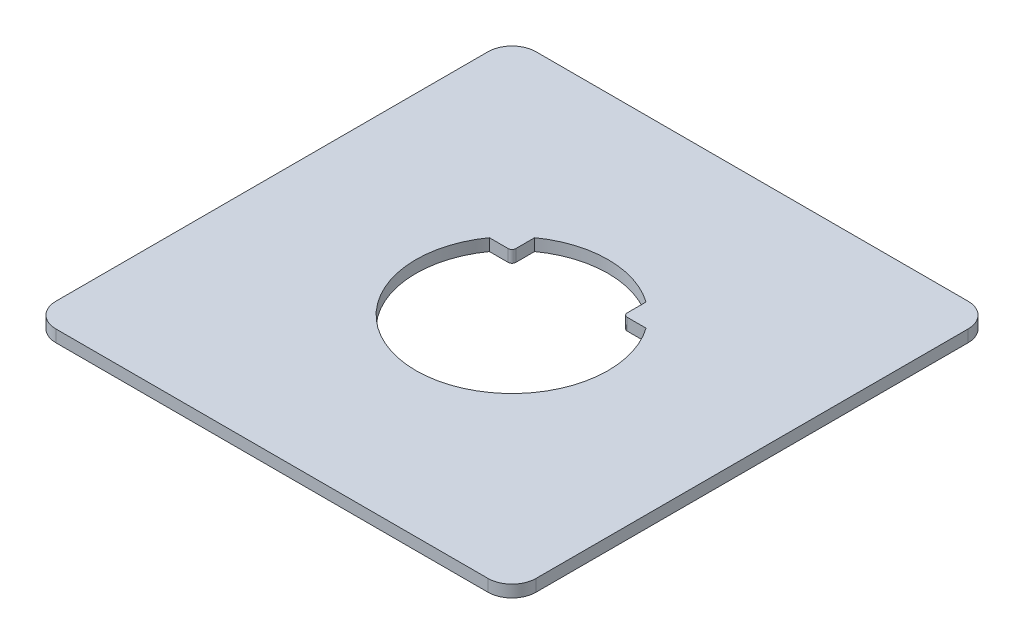
ISO-10303-21;
HEADER;
FILE_DESCRIPTION(('STEP AP214'),'2;1');
FILE_NAME('part.step','',(''),(''),'','','');
FILE_SCHEMA(('AUTOMOTIVE_DESIGN { 1 0 10303 214 1 1 1 1 }'));
ENDSEC;
DATA;
#1=APPLICATION_CONTEXT('core data for automotive mechanical design processes');
#2=APPLICATION_PROTOCOL_DEFINITION('international standard','automotive_design',2000,#1);
#3=PRODUCT_CONTEXT('',#1,'mechanical');
#4=PRODUCT('Part','Part','',(#3));
#5=PRODUCT_RELATED_PRODUCT_CATEGORY('part','',(#4));
#6=PRODUCT_DEFINITION_FORMATION('','',#4);
#7=PRODUCT_DEFINITION_CONTEXT('part definition',#1,'design');
#8=PRODUCT_DEFINITION('design','',#6,#7);
#9=PRODUCT_DEFINITION_SHAPE('','',#8);
#10=(LENGTH_UNIT() NAMED_UNIT(*) SI_UNIT(.MILLI.,.METRE.));
#11=(NAMED_UNIT(*) PLANE_ANGLE_UNIT() SI_UNIT($,.RADIAN.));
#12=(NAMED_UNIT(*) SI_UNIT($,.STERADIAN.) SOLID_ANGLE_UNIT());
#13=UNCERTAINTY_MEASURE_WITH_UNIT(LENGTH_MEASURE(1.E-05),#10,'distance_accuracy_value','');
#14=(GEOMETRIC_REPRESENTATION_CONTEXT(3) GLOBAL_UNCERTAINTY_ASSIGNED_CONTEXT((#13)) GLOBAL_UNIT_ASSIGNED_CONTEXT((#10,
#11,#12)) REPRESENTATION_CONTEXT('',''));
#15=CARTESIAN_POINT('',(0.,0.,0.));
#16=DIRECTION('',(0.,0.,1.));
#17=DIRECTION('',(1.,0.,0.));
#18=AXIS2_PLACEMENT_3D('',#15,#16,#17);
#19=CARTESIAN_POINT('',(0.,1.5875,0.));
#20=DIRECTION('',(0.,-1.,0.));
#21=DIRECTION('',(0.,0.,-1.));
#22=AXIS2_PLACEMENT_3D('',#19,#20,#21);
#23=PLANE('',#22);
#24=DIRECTION('',(1.,0.,0.));
#25=VECTOR('',#24,1.);
#26=CARTESIAN_POINT('',(0.,1.5875,0.));
#27=LINE('',#26,#25);
#28=CARTESIAN_POINT('',(3.175,1.5875,0.));
#29=VERTEX_POINT('',#28);
#30=CARTESIAN_POINT('',(60.325,1.5875,0.));
#31=VERTEX_POINT('',#30);
#32=EDGE_CURVE('E231',#29,#31,#27,.T.);
#33=ORIENTED_EDGE('',*,*,#32,.T.);
#34=CARTESIAN_POINT('',(60.325,1.5875,-3.175));
#35=DIRECTION('',(0.,-1.,0.));
#36=DIRECTION('',(0.,0.,-1.));
#37=AXIS2_PLACEMENT_3D('',#34,#35,#36);
#38=CIRCLE('',#37,3.175);
#39=CARTESIAN_POINT('',(63.5,1.5875,-3.175));
#40=VERTEX_POINT('',#39);
#41=EDGE_CURVE('E313',#31,#40,#38,.F.);
#42=ORIENTED_EDGE('',*,*,#41,.T.);
#43=DIRECTION('',(0.,0.,-1.));
#44=VECTOR('',#43,1.);
#45=CARTESIAN_POINT('',(63.5,1.5875,0.));
#46=LINE('',#45,#44);
#47=CARTESIAN_POINT('',(63.5,1.5875,-60.325));
#48=VERTEX_POINT('',#47);
#49=EDGE_CURVE('E236',#40,#48,#46,.T.);
#50=ORIENTED_EDGE('',*,*,#49,.T.);
#51=CARTESIAN_POINT('',(60.325,1.5875,-60.325));
#52=DIRECTION('',(0.,-1.,0.));
#53=DIRECTION('',(0.,0.,-1.));
#54=AXIS2_PLACEMENT_3D('',#51,#52,#53);
#55=CIRCLE('',#54,3.175);
#56=CARTESIAN_POINT('',(60.325,1.5875,-63.5));
#57=VERTEX_POINT('',#56);
#58=EDGE_CURVE('E62',#48,#57,#55,.F.);
#59=ORIENTED_EDGE('',*,*,#58,.T.);
#60=DIRECTION('',(-1.,0.,0.));
#61=VECTOR('',#60,1.);
#62=CARTESIAN_POINT('',(0.,1.5875,-63.5));
#63=LINE('',#62,#61);
#64=CARTESIAN_POINT('',(3.175,1.5875,-63.5));
#65=VERTEX_POINT('',#64);
#66=EDGE_CURVE('E239',#57,#65,#63,.T.);
#67=ORIENTED_EDGE('',*,*,#66,.T.);
#68=CARTESIAN_POINT('',(3.175,1.5875,-60.325));
#69=DIRECTION('',(0.,-1.,0.));
#70=DIRECTION('',(0.,0.,-1.));
#71=AXIS2_PLACEMENT_3D('',#68,#69,#70);
#72=CIRCLE('',#71,3.175);
#73=CARTESIAN_POINT('',(0.,1.5875,-60.325));
#74=VERTEX_POINT('',#73);
#75=EDGE_CURVE('E308',#65,#74,#72,.F.);
#76=ORIENTED_EDGE('',*,*,#75,.T.);
#77=DIRECTION('',(0.,0.,1.));
#78=VECTOR('',#77,1.);
#79=CARTESIAN_POINT('',(0.,1.5875,0.));
#80=LINE('',#79,#78);
#81=CARTESIAN_POINT('',(0.,1.5875,-3.175));
#82=VERTEX_POINT('',#81);
#83=EDGE_CURVE('E227',#74,#82,#80,.T.);
#84=ORIENTED_EDGE('',*,*,#83,.T.);
#85=CARTESIAN_POINT('',(3.175,1.5875,-3.175));
#86=DIRECTION('',(0.,-1.,0.));
#87=DIRECTION('',(0.,0.,-1.));
#88=AXIS2_PLACEMENT_3D('',#85,#86,#87);
#89=CIRCLE('',#88,3.175);
#90=EDGE_CURVE('E305',#82,#29,#89,.F.);
#91=ORIENTED_EDGE('',*,*,#90,.T.);
#92=EDGE_LOOP('',(#33,#42,#50,#59,#67,#76,#84,#91));
#93=FACE_BOUND('',#92,.T.);
#94=DIRECTION('',(0.,0.,-1.));
#95=VECTOR('',#94,1.);
#96=CARTESIAN_POINT('',(39.116,1.5875,-42.1112154349767));
#97=LINE('',#96,#95);
#98=CARTESIAN_POINT('',(39.116,1.5875,-39.624));
#99=VERTEX_POINT('',#98);
#100=CARTESIAN_POINT('',(39.116,1.5875,-42.1112154349767));
#101=VERTEX_POINT('',#100);
#102=EDGE_CURVE('E198',#99,#101,#97,.T.);
#103=ORIENTED_EDGE('',*,*,#102,.F.);
#104=CARTESIAN_POINT('',(39.624,1.5875,-39.624));
#105=DIRECTION('',(0.,-1.,0.));
#106=DIRECTION('',(0.,0.,-1.));
#107=AXIS2_PLACEMENT_3D('',#104,#105,#106);
#108=CIRCLE('',#107,0.508);
#109=CARTESIAN_POINT('',(39.624,1.5875,-39.116));
#110=VERTEX_POINT('',#109);
#111=EDGE_CURVE('E270',#99,#110,#108,.F.);
#112=ORIENTED_EDGE('',*,*,#111,.T.);
#113=DIRECTION('',(-1.,0.,0.));
#114=VECTOR('',#113,1.);
#115=CARTESIAN_POINT('',(39.116,1.5875,-39.116));
#116=LINE('',#115,#114);
#117=CARTESIAN_POINT('',(42.1112154349767,1.5875,-39.116));
#118=VERTEX_POINT('',#117);
#119=EDGE_CURVE('E194',#118,#110,#116,.T.);
#120=ORIENTED_EDGE('',*,*,#119,.F.);
#121=CARTESIAN_POINT('',(31.75,1.5875,-31.75));
#122=DIRECTION('',(0.,1.,0.));
#123=DIRECTION('',(0.,0.,1.));
#124=AXIS2_PLACEMENT_3D('',#121,#122,#123);
#125=CIRCLE('',#124,12.7127);
#126=CARTESIAN_POINT('',(21.3887845650233,1.5875,-39.116));
#127=VERTEX_POINT('',#126);
#128=EDGE_CURVE('E189',#127,#118,#125,.T.);
#129=ORIENTED_EDGE('',*,*,#128,.F.);
#130=DIRECTION('',(-1.,0.,0.));
#131=VECTOR('',#130,1.);
#132=CARTESIAN_POINT('',(24.384,1.5875,-39.116));
#133=LINE('',#132,#131);
#134=CARTESIAN_POINT('',(23.876,1.5875,-39.116));
#135=VERTEX_POINT('',#134);
#136=EDGE_CURVE('E186',#135,#127,#133,.T.);
#137=ORIENTED_EDGE('',*,*,#136,.F.);
#138=CARTESIAN_POINT('',(23.876,1.5875,-39.624));
#139=DIRECTION('',(0.,-1.,0.));
#140=DIRECTION('',(0.,0.,-1.));
#141=AXIS2_PLACEMENT_3D('',#138,#139,#140);
#142=CIRCLE('',#141,0.508);
#143=CARTESIAN_POINT('',(24.384,1.5875,-39.624));
#144=VERTEX_POINT('',#143);
#145=EDGE_CURVE('E184',#135,#144,#142,.F.);
#146=ORIENTED_EDGE('',*,*,#145,.T.);
#147=DIRECTION('',(0.,0.,1.));
#148=VECTOR('',#147,1.);
#149=CARTESIAN_POINT('',(24.384,1.5875,-42.1112154349767));
#150=LINE('',#149,#148);
#151=CARTESIAN_POINT('',(24.384,1.5875,-42.1112154349767));
#152=VERTEX_POINT('',#151);
#153=EDGE_CURVE('E168',#152,#144,#150,.T.);
#154=ORIENTED_EDGE('',*,*,#153,.F.);
#155=CARTESIAN_POINT('',(31.75,1.5875,-31.75));
#156=DIRECTION('',(0.,1.,0.));
#157=DIRECTION('',(0.,0.,1.));
#158=AXIS2_PLACEMENT_3D('',#155,#156,#157);
#159=CIRCLE('',#158,12.7127);
#160=EDGE_CURVE('E156',#101,#152,#159,.T.);
#161=ORIENTED_EDGE('',*,*,#160,.F.);
#162=EDGE_LOOP('',(#103,#112,#120,#129,#137,#146,#154,#161));
#163=FACE_BOUND('',#162,.T.);
#164=ADVANCED_FACE('F39',(#93,#163),#23,.F.);
#165=CARTESIAN_POINT('',(0.,0.,0.));
#166=DIRECTION('',(0.,-1.,0.));
#167=DIRECTION('',(0.,0.,-1.));
#168=AXIS2_PLACEMENT_3D('',#165,#166,#167);
#169=PLANE('',#168);
#170=DIRECTION('',(0.,0.,-1.));
#171=VECTOR('',#170,1.);
#172=CARTESIAN_POINT('',(63.5,0.,0.));
#173=LINE('',#172,#171);
#174=CARTESIAN_POINT('',(63.5,0.,-3.175));
#175=VERTEX_POINT('',#174);
#176=CARTESIAN_POINT('',(63.5,0.,-60.325));
#177=VERTEX_POINT('',#176);
#178=EDGE_CURVE('E250',#175,#177,#173,.T.);
#179=ORIENTED_EDGE('',*,*,#178,.F.);
#180=CARTESIAN_POINT('',(60.325,0.,-3.175));
#181=DIRECTION('',(0.,-1.,0.));
#182=DIRECTION('',(0.,0.,-1.));
#183=AXIS2_PLACEMENT_3D('',#180,#181,#182);
#184=CIRCLE('',#183,3.175);
#185=CARTESIAN_POINT('',(60.325,0.,0.));
#186=VERTEX_POINT('',#185);
#187=EDGE_CURVE('E295',#175,#186,#184,.T.);
#188=ORIENTED_EDGE('',*,*,#187,.T.);
#189=DIRECTION('',(1.,0.,0.));
#190=VECTOR('',#189,1.);
#191=CARTESIAN_POINT('',(0.,0.,0.));
#192=LINE('',#191,#190);
#193=CARTESIAN_POINT('',(3.175,0.,0.));
#194=VERTEX_POINT('',#193);
#195=EDGE_CURVE('E246',#194,#186,#192,.T.);
#196=ORIENTED_EDGE('',*,*,#195,.F.);
#197=CARTESIAN_POINT('',(3.175,0.,-3.175));
#198=DIRECTION('',(0.,-1.,0.));
#199=DIRECTION('',(0.,0.,-1.));
#200=AXIS2_PLACEMENT_3D('',#197,#198,#199);
#201=CIRCLE('',#200,3.175);
#202=CARTESIAN_POINT('',(0.,0.,-3.175));
#203=VERTEX_POINT('',#202);
#204=EDGE_CURVE('E286',#194,#203,#201,.T.);
#205=ORIENTED_EDGE('',*,*,#204,.T.);
#206=DIRECTION('',(0.,0.,1.));
#207=VECTOR('',#206,1.);
#208=CARTESIAN_POINT('',(0.,0.,0.));
#209=LINE('',#208,#207);
#210=CARTESIAN_POINT('',(0.,0.,-60.325));
#211=VERTEX_POINT('',#210);
#212=EDGE_CURVE('E179',#211,#203,#209,.T.);
#213=ORIENTED_EDGE('',*,*,#212,.F.);
#214=CARTESIAN_POINT('',(3.175,0.,-60.325));
#215=DIRECTION('',(0.,-1.,0.));
#216=DIRECTION('',(0.,0.,-1.));
#217=AXIS2_PLACEMENT_3D('',#214,#215,#216);
#218=CIRCLE('',#217,3.175);
#219=CARTESIAN_POINT('',(3.175,0.,-63.5));
#220=VERTEX_POINT('',#219);
#221=EDGE_CURVE('E289',#211,#220,#218,.T.);
#222=ORIENTED_EDGE('',*,*,#221,.T.);
#223=DIRECTION('',(-1.,0.,0.));
#224=VECTOR('',#223,1.);
#225=CARTESIAN_POINT('',(0.,0.,-63.5));
#226=LINE('',#225,#224);
#227=CARTESIAN_POINT('',(60.325,0.,-63.5));
#228=VERTEX_POINT('',#227);
#229=EDGE_CURVE('E232',#228,#220,#226,.T.);
#230=ORIENTED_EDGE('',*,*,#229,.F.);
#231=CARTESIAN_POINT('',(60.325,0.,-60.325));
#232=DIRECTION('',(0.,-1.,0.));
#233=DIRECTION('',(0.,0.,-1.));
#234=AXIS2_PLACEMENT_3D('',#231,#232,#233);
#235=CIRCLE('',#234,3.175);
#236=EDGE_CURVE('E292',#228,#177,#235,.T.);
#237=ORIENTED_EDGE('',*,*,#236,.T.);
#238=EDGE_LOOP('',(#179,#188,#196,#205,#213,#222,#230,#237));
#239=FACE_BOUND('',#238,.T.);
#240=DIRECTION('',(-1.,0.,0.));
#241=VECTOR('',#240,1.);
#242=CARTESIAN_POINT('',(39.116,0.,-39.116));
#243=LINE('',#242,#241);
#244=CARTESIAN_POINT('',(42.1112154349767,0.,-39.116));
#245=VERTEX_POINT('',#244);
#246=CARTESIAN_POINT('',(39.624,0.,-39.116));
#247=VERTEX_POINT('',#246);
#248=EDGE_CURVE('E213',#245,#247,#243,.T.);
#249=ORIENTED_EDGE('',*,*,#248,.T.);
#250=CARTESIAN_POINT('',(39.624,0.,-39.624));
#251=DIRECTION('',(0.,-1.,0.));
#252=DIRECTION('',(0.,0.,-1.));
#253=AXIS2_PLACEMENT_3D('',#250,#251,#252);
#254=CIRCLE('',#253,0.508);
#255=CARTESIAN_POINT('',(39.116,0.,-39.624));
#256=VERTEX_POINT('',#255);
#257=EDGE_CURVE('E262',#247,#256,#254,.T.);
#258=ORIENTED_EDGE('',*,*,#257,.T.);
#259=DIRECTION('',(0.,0.,-1.));
#260=VECTOR('',#259,1.);
#261=CARTESIAN_POINT('',(39.116,0.,-42.1112154349767));
#262=LINE('',#261,#260);
#263=CARTESIAN_POINT('',(39.116,0.,-42.1112154349767));
#264=VERTEX_POINT('',#263);
#265=EDGE_CURVE('E169',#256,#264,#262,.T.);
#266=ORIENTED_EDGE('',*,*,#265,.T.);
#267=CARTESIAN_POINT('',(31.75,0.,-31.75));
#268=DIRECTION('',(0.,1.,0.));
#269=DIRECTION('',(0.,0.,1.));
#270=AXIS2_PLACEMENT_3D('',#267,#268,#269);
#271=CIRCLE('',#270,12.7127);
#272=CARTESIAN_POINT('',(24.384,0.,-42.1112154349767));
#273=VERTEX_POINT('',#272);
#274=EDGE_CURVE('E201',#264,#273,#271,.T.);
#275=ORIENTED_EDGE('',*,*,#274,.T.);
#276=DIRECTION('',(0.,0.,1.));
#277=VECTOR('',#276,1.);
#278=CARTESIAN_POINT('',(24.384,0.,-42.1112154349767));
#279=LINE('',#278,#277);
#280=CARTESIAN_POINT('',(24.384,0.,-39.624));
#281=VERTEX_POINT('',#280);
#282=EDGE_CURVE('E177',#273,#281,#279,.T.);
#283=ORIENTED_EDGE('',*,*,#282,.T.);
#284=CARTESIAN_POINT('',(23.876,0.,-39.624));
#285=DIRECTION('',(0.,-1.,0.));
#286=DIRECTION('',(0.,0.,-1.));
#287=AXIS2_PLACEMENT_3D('',#284,#285,#286);
#288=CIRCLE('',#287,0.508);
#289=CARTESIAN_POINT('',(23.876,0.,-39.116));
#290=VERTEX_POINT('',#289);
#291=EDGE_CURVE('E259',#281,#290,#288,.T.);
#292=ORIENTED_EDGE('',*,*,#291,.T.);
#293=DIRECTION('',(-1.,0.,0.));
#294=VECTOR('',#293,1.);
#295=CARTESIAN_POINT('',(24.384,0.,-39.116));
#296=LINE('',#295,#294);
#297=CARTESIAN_POINT('',(21.3887845650233,0.,-39.116));
#298=VERTEX_POINT('',#297);
#299=EDGE_CURVE('E206',#290,#298,#296,.T.);
#300=ORIENTED_EDGE('',*,*,#299,.T.);
#301=CARTESIAN_POINT('',(31.75,0.,-31.75));
#302=DIRECTION('',(0.,1.,0.));
#303=DIRECTION('',(0.,0.,1.));
#304=AXIS2_PLACEMENT_3D('',#301,#302,#303);
#305=CIRCLE('',#304,12.7127);
#306=EDGE_CURVE('E209',#298,#245,#305,.T.);
#307=ORIENTED_EDGE('',*,*,#306,.T.);
#308=EDGE_LOOP('',(#249,#258,#266,#275,#283,#292,#300,#307));
#309=FACE_BOUND('',#308,.T.);
#310=ADVANCED_FACE('F339',(#239,#309),#169,.T.);
#311=CARTESIAN_POINT('',(0.,1.5875,0.));
#312=DIRECTION('',(1.,0.,0.));
#313=DIRECTION('',(0.,0.,-1.));
#314=AXIS2_PLACEMENT_3D('',#311,#312,#313);
#315=PLANE('',#314);
#316=ORIENTED_EDGE('',*,*,#83,.F.);
#317=DIRECTION('',(0.,-1.,0.));
#318=VECTOR('',#317,1.);
#319=CARTESIAN_POINT('',(0.,1.5875,-60.325));
#320=LINE('',#319,#318);
#321=EDGE_CURVE('E11',#74,#211,#320,.T.);
#322=ORIENTED_EDGE('',*,*,#321,.T.);
#323=ORIENTED_EDGE('',*,*,#212,.T.);
#324=DIRECTION('',(0.,-1.,0.));
#325=VECTOR('',#324,1.);
#326=CARTESIAN_POINT('',(0.,1.5875,-3.175));
#327=LINE('',#326,#325);
#328=EDGE_CURVE('E48',#203,#82,#327,.F.);
#329=ORIENTED_EDGE('',*,*,#328,.T.);
#330=EDGE_LOOP('',(#316,#322,#323,#329));
#331=FACE_BOUND('',#330,.T.);
#332=ADVANCED_FACE('F325',(#331),#315,.F.);
#333=CARTESIAN_POINT('',(0.,1.5875,0.));
#334=DIRECTION('',(0.,0.,-1.));
#335=DIRECTION('',(-1.,0.,0.));
#336=AXIS2_PLACEMENT_3D('',#333,#334,#335);
#337=PLANE('',#336);
#338=ORIENTED_EDGE('',*,*,#195,.T.);
#339=DIRECTION('',(0.,-1.,0.));
#340=VECTOR('',#339,1.);
#341=CARTESIAN_POINT('',(60.325,1.5875,0.));
#342=LINE('',#341,#340);
#343=EDGE_CURVE('E302',#186,#31,#342,.F.);
#344=ORIENTED_EDGE('',*,*,#343,.T.);
#345=ORIENTED_EDGE('',*,*,#32,.F.);
#346=DIRECTION('',(0.,-1.,0.));
#347=VECTOR('',#346,1.);
#348=CARTESIAN_POINT('',(3.175,1.5875,0.));
#349=LINE('',#348,#347);
#350=EDGE_CURVE('E298',#29,#194,#349,.T.);
#351=ORIENTED_EDGE('',*,*,#350,.T.);
#352=EDGE_LOOP('',(#338,#344,#345,#351));
#353=FACE_BOUND('',#352,.T.);
#354=ADVANCED_FACE('F335',(#353),#337,.F.);
#355=CARTESIAN_POINT('',(63.5,1.5875,0.));
#356=DIRECTION('',(-1.,0.,0.));
#357=DIRECTION('',(0.,0.,1.));
#358=AXIS2_PLACEMENT_3D('',#355,#356,#357);
#359=PLANE('',#358);
#360=ORIENTED_EDGE('',*,*,#49,.F.);
#361=DIRECTION('',(0.,-1.,0.));
#362=VECTOR('',#361,1.);
#363=CARTESIAN_POINT('',(63.5,1.5875,-3.175));
#364=LINE('',#363,#362);
#365=EDGE_CURVE('E282',#40,#175,#364,.T.);
#366=ORIENTED_EDGE('',*,*,#365,.T.);
#367=ORIENTED_EDGE('',*,*,#178,.T.);
#368=DIRECTION('',(0.,-1.,0.));
#369=VECTOR('',#368,1.);
#370=CARTESIAN_POINT('',(63.5,1.5875,-60.325));
#371=LINE('',#370,#369);
#372=EDGE_CURVE('E279',#177,#48,#371,.F.);
#373=ORIENTED_EDGE('',*,*,#372,.T.);
#374=EDGE_LOOP('',(#360,#366,#367,#373));
#375=FACE_BOUND('',#374,.T.);
#376=ADVANCED_FACE('F347',(#375),#359,.F.);
#377=CARTESIAN_POINT('',(0.,1.5875,-63.5));
#378=DIRECTION('',(0.,0.,1.));
#379=DIRECTION('',(1.,0.,0.));
#380=AXIS2_PLACEMENT_3D('',#377,#378,#379);
#381=PLANE('',#380);
#382=ORIENTED_EDGE('',*,*,#66,.F.);
#383=DIRECTION('',(0.,-1.,0.));
#384=VECTOR('',#383,1.);
#385=CARTESIAN_POINT('',(60.325,1.5875,-63.5));
#386=LINE('',#385,#384);
#387=EDGE_CURVE('E318',#57,#228,#386,.T.);
#388=ORIENTED_EDGE('',*,*,#387,.T.);
#389=ORIENTED_EDGE('',*,*,#229,.T.);
#390=DIRECTION('',(0.,-1.,0.));
#391=VECTOR('',#390,1.);
#392=CARTESIAN_POINT('',(3.175,1.5875,-63.5));
#393=LINE('',#392,#391);
#394=EDGE_CURVE('E55',#220,#65,#393,.F.);
#395=ORIENTED_EDGE('',*,*,#394,.T.);
#396=EDGE_LOOP('',(#382,#388,#389,#395));
#397=FACE_BOUND('',#396,.T.);
#398=ADVANCED_FACE('F353',(#397),#381,.F.);
#399=CARTESIAN_POINT('',(31.75,1.5875,-31.75));
#400=DIRECTION('',(0.,-1.,0.));
#401=DIRECTION('',(0.,0.,-1.));
#402=AXIS2_PLACEMENT_3D('',#399,#400,#401);
#403=CYLINDRICAL_SURFACE('',#402,12.7127);
#404=ORIENTED_EDGE('',*,*,#274,.F.);
#405=DIRECTION('',(0.,-1.,0.));
#406=VECTOR('',#405,1.);
#407=CARTESIAN_POINT('',(39.116,1.5875,-42.1112154349767));
#408=LINE('',#407,#406);
#409=EDGE_CURVE('E163',#101,#264,#408,.T.);
#410=ORIENTED_EDGE('',*,*,#409,.F.);
#411=ORIENTED_EDGE('',*,*,#160,.T.);
#412=DIRECTION('',(0.,-1.,0.));
#413=VECTOR('',#412,1.);
#414=CARTESIAN_POINT('',(24.384,1.5875,-42.1112154349767));
#415=LINE('',#414,#413);
#416=EDGE_CURVE('E160',#152,#273,#415,.T.);
#417=ORIENTED_EDGE('',*,*,#416,.T.);
#418=EDGE_LOOP('',(#404,#410,#411,#417));
#419=FACE_BOUND('',#418,.T.);
#420=ADVANCED_FACE('F159',(#419),#403,.F.);
#421=CARTESIAN_POINT('',(24.384,1.5875,-42.1112154349767));
#422=DIRECTION('',(1.,0.,0.));
#423=DIRECTION('',(0.,0.,-1.));
#424=AXIS2_PLACEMENT_3D('',#421,#422,#423);
#425=PLANE('',#424);
#426=ORIENTED_EDGE('',*,*,#153,.T.);
#427=DIRECTION('',(0.,-1.,0.));
#428=VECTOR('',#427,1.);
#429=CARTESIAN_POINT('',(24.384,1.5875,-39.624));
#430=LINE('',#429,#428);
#431=EDGE_CURVE('E273',#144,#281,#430,.T.);
#432=ORIENTED_EDGE('',*,*,#431,.T.);
#433=ORIENTED_EDGE('',*,*,#282,.F.);
#434=ORIENTED_EDGE('',*,*,#416,.F.);
#435=EDGE_LOOP('',(#426,#432,#433,#434));
#436=FACE_BOUND('',#435,.T.);
#437=ADVANCED_FACE('F173',(#436),#425,.T.);
#438=CARTESIAN_POINT('',(24.384,1.5875,-39.116));
#439=DIRECTION('',(0.,0.,1.));
#440=DIRECTION('',(1.,0.,0.));
#441=AXIS2_PLACEMENT_3D('',#438,#439,#440);
#442=PLANE('',#441);
#443=ORIENTED_EDGE('',*,*,#299,.F.);
#444=DIRECTION('',(0.,-1.,0.));
#445=VECTOR('',#444,1.);
#446=CARTESIAN_POINT('',(23.876,1.5875,-39.116));
#447=LINE('',#446,#445);
#448=EDGE_CURVE('E276',#290,#135,#447,.F.);
#449=ORIENTED_EDGE('',*,*,#448,.T.);
#450=ORIENTED_EDGE('',*,*,#136,.T.);
#451=DIRECTION('',(0.,-1.,0.));
#452=VECTOR('',#451,1.);
#453=CARTESIAN_POINT('',(21.3887845650233,1.5875,-39.116));
#454=LINE('',#453,#452);
#455=EDGE_CURVE('E180',#127,#298,#454,.T.);
#456=ORIENTED_EDGE('',*,*,#455,.T.);
#457=EDGE_LOOP('',(#443,#449,#450,#456));
#458=FACE_BOUND('',#457,.T.);
#459=ADVANCED_FACE('F448',(#458),#442,.T.);
#460=CARTESIAN_POINT('',(31.75,1.5875,-31.75));
#461=DIRECTION('',(0.,-1.,0.));
#462=DIRECTION('',(0.,0.,-1.));
#463=AXIS2_PLACEMENT_3D('',#460,#461,#462);
#464=CYLINDRICAL_SURFACE('',#463,12.7127);
#465=ORIENTED_EDGE('',*,*,#306,.F.);
#466=ORIENTED_EDGE('',*,*,#455,.F.);
#467=ORIENTED_EDGE('',*,*,#128,.T.);
#468=DIRECTION('',(0.,-1.,0.));
#469=VECTOR('',#468,1.);
#470=CARTESIAN_POINT('',(42.1112154349767,1.5875,-39.116));
#471=LINE('',#470,#469);
#472=EDGE_CURVE('E221',#118,#245,#471,.T.);
#473=ORIENTED_EDGE('',*,*,#472,.T.);
#474=EDGE_LOOP('',(#465,#466,#467,#473));
#475=FACE_BOUND('',#474,.T.);
#476=ADVANCED_FACE('F438',(#475),#464,.F.);
#477=CARTESIAN_POINT('',(39.116,1.5875,-39.116));
#478=DIRECTION('',(0.,0.,1.));
#479=DIRECTION('',(1.,0.,0.));
#480=AXIS2_PLACEMENT_3D('',#477,#478,#479);
#481=PLANE('',#480);
#482=ORIENTED_EDGE('',*,*,#119,.T.);
#483=DIRECTION('',(0.,-1.,0.));
#484=VECTOR('',#483,1.);
#485=CARTESIAN_POINT('',(39.624,1.5875,-39.116));
#486=LINE('',#485,#484);
#487=EDGE_CURVE('E242',#110,#247,#486,.T.);
#488=ORIENTED_EDGE('',*,*,#487,.T.);
#489=ORIENTED_EDGE('',*,*,#248,.F.);
#490=ORIENTED_EDGE('',*,*,#472,.F.);
#491=EDGE_LOOP('',(#482,#488,#489,#490));
#492=FACE_BOUND('',#491,.T.);
#493=ADVANCED_FACE('F429',(#492),#481,.T.);
#494=CARTESIAN_POINT('',(39.116,1.5875,-42.1112154349767));
#495=DIRECTION('',(-1.,0.,0.));
#496=DIRECTION('',(0.,0.,1.));
#497=AXIS2_PLACEMENT_3D('',#494,#495,#496);
#498=PLANE('',#497);
#499=ORIENTED_EDGE('',*,*,#265,.F.);
#500=DIRECTION('',(0.,-1.,0.));
#501=VECTOR('',#500,1.);
#502=CARTESIAN_POINT('',(39.116,1.5875,-39.624));
#503=LINE('',#502,#501);
#504=EDGE_CURVE('E265',#256,#99,#503,.F.);
#505=ORIENTED_EDGE('',*,*,#504,.T.);
#506=ORIENTED_EDGE('',*,*,#102,.T.);
#507=ORIENTED_EDGE('',*,*,#409,.T.);
#508=EDGE_LOOP('',(#499,#505,#506,#507));
#509=FACE_BOUND('',#508,.T.);
#510=ADVANCED_FACE('F383',(#509),#498,.T.);
#511=CARTESIAN_POINT('',(39.624,1.5875,-39.624));
#512=DIRECTION('',(0.,-1.,0.));
#513=DIRECTION('',(0.,0.,-1.));
#514=AXIS2_PLACEMENT_3D('',#511,#512,#513);
#515=CYLINDRICAL_SURFACE('',#514,0.508);
#516=ORIENTED_EDGE('',*,*,#111,.F.);
#517=ORIENTED_EDGE('',*,*,#504,.F.);
#518=ORIENTED_EDGE('',*,*,#257,.F.);
#519=ORIENTED_EDGE('',*,*,#487,.F.);
#520=EDGE_LOOP('',(#516,#517,#518,#519));
#521=FACE_BOUND('',#520,.T.);
#522=ADVANCED_FACE('F379',(#521),#515,.T.);
#523=CARTESIAN_POINT('',(23.876,1.5875,-39.624));
#524=DIRECTION('',(0.,-1.,0.));
#525=DIRECTION('',(0.,0.,-1.));
#526=AXIS2_PLACEMENT_3D('',#523,#524,#525);
#527=CYLINDRICAL_SURFACE('',#526,0.508);
#528=ORIENTED_EDGE('',*,*,#145,.F.);
#529=ORIENTED_EDGE('',*,*,#448,.F.);
#530=ORIENTED_EDGE('',*,*,#291,.F.);
#531=ORIENTED_EDGE('',*,*,#431,.F.);
#532=EDGE_LOOP('',(#528,#529,#530,#531));
#533=FACE_BOUND('',#532,.T.);
#534=ADVANCED_FACE('F382',(#533),#527,.T.);
#535=CARTESIAN_POINT('',(60.325,1.5875,-3.175));
#536=DIRECTION('',(0.,-1.,0.));
#537=DIRECTION('',(0.,0.,-1.));
#538=AXIS2_PLACEMENT_3D('',#535,#536,#537);
#539=CYLINDRICAL_SURFACE('',#538,3.175);
#540=ORIENTED_EDGE('',*,*,#41,.F.);
#541=ORIENTED_EDGE('',*,*,#343,.F.);
#542=ORIENTED_EDGE('',*,*,#187,.F.);
#543=ORIENTED_EDGE('',*,*,#365,.F.);
#544=EDGE_LOOP('',(#540,#541,#542,#543));
#545=FACE_BOUND('',#544,.T.);
#546=ADVANCED_FACE('F344',(#545),#539,.T.);
#547=CARTESIAN_POINT('',(60.325,1.5875,-60.325));
#548=DIRECTION('',(0.,-1.,0.));
#549=DIRECTION('',(0.,0.,-1.));
#550=AXIS2_PLACEMENT_3D('',#547,#548,#549);
#551=CYLINDRICAL_SURFACE('',#550,3.175);
#552=ORIENTED_EDGE('',*,*,#58,.F.);
#553=ORIENTED_EDGE('',*,*,#372,.F.);
#554=ORIENTED_EDGE('',*,*,#236,.F.);
#555=ORIENTED_EDGE('',*,*,#387,.F.);
#556=EDGE_LOOP('',(#552,#553,#554,#555));
#557=FACE_BOUND('',#556,.T.);
#558=ADVANCED_FACE('F351',(#557),#551,.T.);
#559=CARTESIAN_POINT('',(3.175,1.5875,-60.325));
#560=DIRECTION('',(0.,-1.,0.));
#561=DIRECTION('',(0.,0.,-1.));
#562=AXIS2_PLACEMENT_3D('',#559,#560,#561);
#563=CYLINDRICAL_SURFACE('',#562,3.175);
#564=ORIENTED_EDGE('',*,*,#75,.F.);
#565=ORIENTED_EDGE('',*,*,#394,.F.);
#566=ORIENTED_EDGE('',*,*,#221,.F.);
#567=ORIENTED_EDGE('',*,*,#321,.F.);
#568=EDGE_LOOP('',(#564,#565,#566,#567));
#569=FACE_BOUND('',#568,.T.);
#570=ADVANCED_FACE('F355',(#569),#563,.T.);
#571=CARTESIAN_POINT('',(3.175,1.5875,-3.175));
#572=DIRECTION('',(0.,-1.,0.));
#573=DIRECTION('',(0.,0.,-1.));
#574=AXIS2_PLACEMENT_3D('',#571,#572,#573);
#575=CYLINDRICAL_SURFACE('',#574,3.175);
#576=ORIENTED_EDGE('',*,*,#90,.F.);
#577=ORIENTED_EDGE('',*,*,#328,.F.);
#578=ORIENTED_EDGE('',*,*,#204,.F.);
#579=ORIENTED_EDGE('',*,*,#350,.F.);
#580=EDGE_LOOP('',(#576,#577,#578,#579));
#581=FACE_BOUND('',#580,.T.);
#582=ADVANCED_FACE('F41',(#581),#575,.T.);
#583=CLOSED_SHELL('',(#164,#310,#332,#354,#376,#398,#420,#437,#459,#476,#493,#510,#522,#534,
#546,#558,#570,#582));
#584=MANIFOLD_SOLID_BREP('B2',#583);
#585=ADVANCED_BREP_SHAPE_REPRESENTATION('',(#18,#584),#14);
#586=SHAPE_DEFINITION_REPRESENTATION(#9,#585);
ENDSEC;
END-ISO-10303-21;
